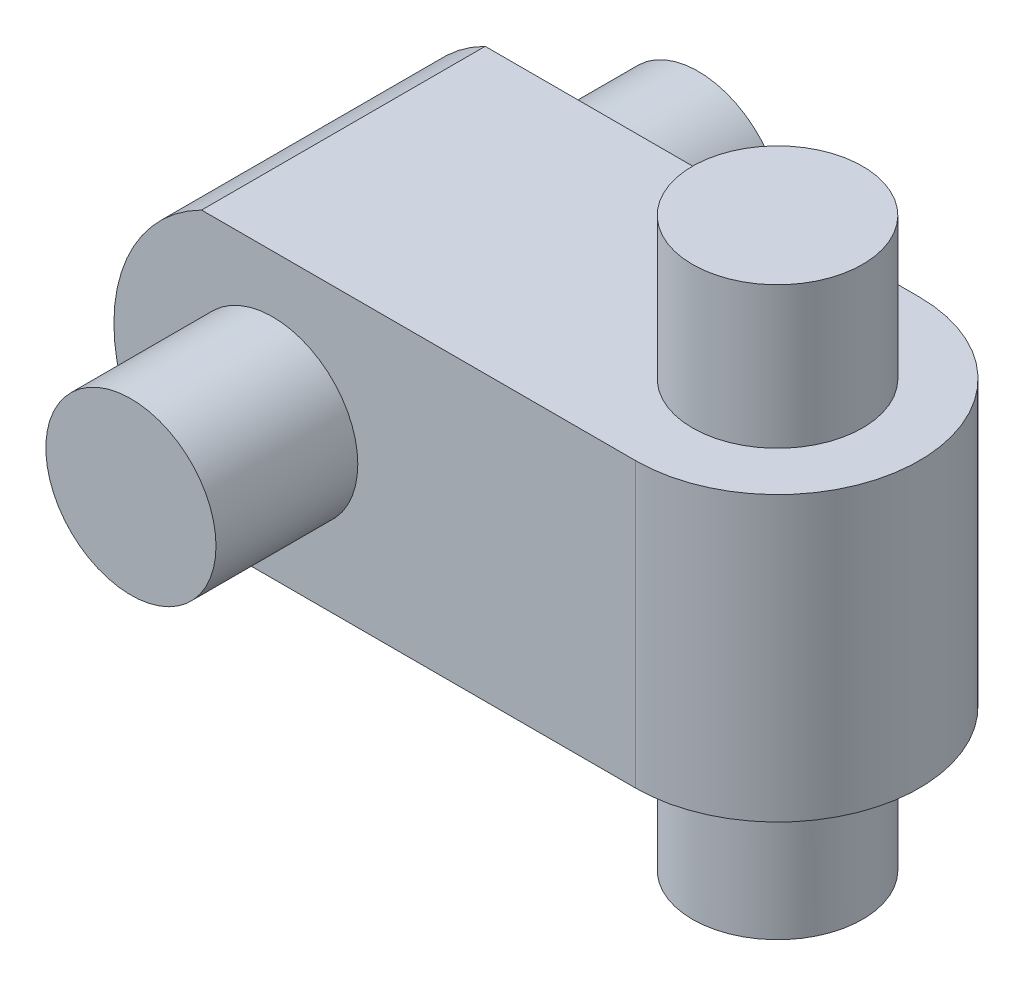
ISO-10303-21;
HEADER;
FILE_DESCRIPTION(('STEP AP214'),'2;1');
FILE_NAME('part.step','',(''),(''),'','','');
FILE_SCHEMA(('AUTOMOTIVE_DESIGN { 1 0 10303 214 1 1 1 1 }'));
ENDSEC;
DATA;
#1=APPLICATION_CONTEXT('core data for automotive mechanical design processes');
#2=APPLICATION_PROTOCOL_DEFINITION('international standard','automotive_design',2000,#1);
#3=PRODUCT_CONTEXT('',#1,'mechanical');
#4=PRODUCT('Part','Part','',(#3));
#5=PRODUCT_RELATED_PRODUCT_CATEGORY('part','',(#4));
#6=PRODUCT_DEFINITION_FORMATION('','',#4);
#7=PRODUCT_DEFINITION_CONTEXT('part definition',#1,'design');
#8=PRODUCT_DEFINITION('design','',#6,#7);
#9=PRODUCT_DEFINITION_SHAPE('','',#8);
#10=(LENGTH_UNIT() NAMED_UNIT(*) SI_UNIT(.MILLI.,.METRE.));
#11=(NAMED_UNIT(*) PLANE_ANGLE_UNIT() SI_UNIT($,.RADIAN.));
#12=(NAMED_UNIT(*) SI_UNIT($,.STERADIAN.) SOLID_ANGLE_UNIT());
#13=UNCERTAINTY_MEASURE_WITH_UNIT(LENGTH_MEASURE(1.E-05),#10,'distance_accuracy_value','');
#14=(GEOMETRIC_REPRESENTATION_CONTEXT(3) GLOBAL_UNCERTAINTY_ASSIGNED_CONTEXT((#13)) GLOBAL_UNIT_ASSIGNED_CONTEXT((#10,
#11,#12)) REPRESENTATION_CONTEXT('',''));
#15=CARTESIAN_POINT('',(0.,0.,0.));
#16=DIRECTION('',(0.,0.,1.));
#17=DIRECTION('',(1.,0.,0.));
#18=AXIS2_PLACEMENT_3D('',#15,#16,#17);
#19=CARTESIAN_POINT('',(-6.15277822894734,29.5086989575728,25.));
#20=DIRECTION('',(0.,0.,1.));
#21=DIRECTION('',(1.,0.,0.));
#22=AXIS2_PLACEMENT_3D('',#19,#20,#21);
#23=PLANE('',#22);
#24=CARTESIAN_POINT('',(-6.15277822894734,29.5086989575728,25.));
#25=DIRECTION('',(0.,0.,1.));
#26=DIRECTION('',(1.,0.,0.));
#27=AXIS2_PLACEMENT_3D('',#24,#25,#26);
#28=CIRCLE('',#27,7.5);
#29=CARTESIAN_POINT('',(1.34722177105266,29.5086989575728,25.));
#30=VERTEX_POINT('',#29);
#31=EDGE_CURVE('E180',#30,#30,#28,.F.);
#32=ORIENTED_EDGE('',*,*,#31,.T.);
#33=EDGE_LOOP('',(#32));
#34=FACE_BOUND('',#33,.T.);
#35=DIRECTION('',(-1.,0.,0.));
#36=VECTOR('',#35,1.);
#37=CARTESIAN_POINT('',(-6.15277822894734,17.0253656242395,25.));
#38=LINE('',#37,#36);
#39=CARTESIAN_POINT('',(25.8472217710527,17.0253656242395,25.));
#40=VERTEX_POINT('',#39);
#41=CARTESIAN_POINT('',(-12.4904740948665,17.0253656242395,25.));
#42=VERTEX_POINT('',#41);
#43=EDGE_CURVE('E66',#40,#42,#38,.T.);
#44=ORIENTED_EDGE('',*,*,#43,.F.);
#45=DIRECTION('',(0.,-1.,0.));
#46=VECTOR('',#45,1.);
#47=CARTESIAN_POINT('',(25.8472217710527,60.,25.));
#48=LINE('',#47,#46);
#49=CARTESIAN_POINT('',(25.8472217710527,42.0253656242395,25.));
#50=VERTEX_POINT('',#49);
#51=EDGE_CURVE('E110',#50,#40,#48,.T.);
#52=ORIENTED_EDGE('',*,*,#51,.F.);
#53=DIRECTION('',(-1.,0.,0.));
#54=VECTOR('',#53,1.);
#55=CARTESIAN_POINT('',(-6.15277822894734,42.0253656242395,25.));
#56=LINE('',#55,#54);
#57=CARTESIAN_POINT('',(-12.424385324067,42.0253656242395,25.));
#58=VERTEX_POINT('',#57);
#59=EDGE_CURVE('E106',#50,#58,#56,.T.);
#60=ORIENTED_EDGE('',*,*,#59,.T.);
#61=CARTESIAN_POINT('',(-6.15277822894734,29.5086989575728,25.));
#62=DIRECTION('',(0.,0.,1.));
#63=DIRECTION('',(1.,0.,0.));
#64=AXIS2_PLACEMENT_3D('',#61,#62,#63);
#65=CIRCLE('',#64,14.);
#66=EDGE_CURVE('E104',#58,#42,#65,.T.);
#67=ORIENTED_EDGE('',*,*,#66,.T.);
#68=EDGE_LOOP('',(#44,#52,#60,#67));
#69=FACE_BOUND('',#68,.T.);
#70=ADVANCED_FACE('F45',(#34,#69),#23,.T.);
#71=CARTESIAN_POINT('',(-6.15277822894734,29.5086989575728,0.));
#72=DIRECTION('',(0.,0.,1.));
#73=DIRECTION('',(1.,0.,0.));
#74=AXIS2_PLACEMENT_3D('',#71,#72,#73);
#75=PLANE('',#74);
#76=CARTESIAN_POINT('',(-6.15277822894734,29.5086989575728,0.));
#77=DIRECTION('',(0.,0.,1.));
#78=DIRECTION('',(1.,0.,0.));
#79=AXIS2_PLACEMENT_3D('',#76,#77,#78);
#80=CIRCLE('',#79,7.5);
#81=CARTESIAN_POINT('',(1.34722177105266,29.5086989575728,0.));
#82=VERTEX_POINT('',#81);
#83=EDGE_CURVE('E11',#82,#82,#80,.F.);
#84=ORIENTED_EDGE('',*,*,#83,.F.);
#85=EDGE_LOOP('',(#84));
#86=FACE_BOUND('',#85,.T.);
#87=DIRECTION('',(0.,-1.,0.));
#88=VECTOR('',#87,1.);
#89=CARTESIAN_POINT('',(25.8472217710527,60.,0.));
#90=LINE('',#89,#88);
#91=CARTESIAN_POINT('',(25.8472217710527,17.0253656242395,0.));
#92=VERTEX_POINT('',#91);
#93=CARTESIAN_POINT('',(25.8472217710527,42.0253656242395,0.));
#94=VERTEX_POINT('',#93);
#95=EDGE_CURVE('E114',#92,#94,#90,.F.);
#96=ORIENTED_EDGE('',*,*,#95,.F.);
#97=DIRECTION('',(1.,0.,0.));
#98=VECTOR('',#97,1.);
#99=CARTESIAN_POINT('',(0.,17.0253656242395,0.));
#100=LINE('',#99,#98);
#101=CARTESIAN_POINT('',(-12.4904740948665,17.0253656242395,0.));
#102=VERTEX_POINT('',#101);
#103=EDGE_CURVE('E61',#102,#92,#100,.T.);
#104=ORIENTED_EDGE('',*,*,#103,.F.);
#105=CARTESIAN_POINT('',(-6.15277822894734,29.5086989575728,0.));
#106=DIRECTION('',(0.,0.,1.));
#107=DIRECTION('',(1.,0.,0.));
#108=AXIS2_PLACEMENT_3D('',#105,#106,#107);
#109=CIRCLE('',#108,14.);
#110=CARTESIAN_POINT('',(-12.424385324067,42.0253656242395,0.));
#111=VERTEX_POINT('',#110);
#112=EDGE_CURVE('E102',#111,#102,#109,.T.);
#113=ORIENTED_EDGE('',*,*,#112,.F.);
#114=DIRECTION('',(1.,0.,0.));
#115=VECTOR('',#114,1.);
#116=CARTESIAN_POINT('',(0.,42.0253656242395,0.));
#117=LINE('',#116,#115);
#118=EDGE_CURVE('E85',#111,#94,#117,.T.);
#119=ORIENTED_EDGE('',*,*,#118,.T.);
#120=EDGE_LOOP('',(#96,#104,#113,#119));
#121=FACE_BOUND('',#120,.T.);
#122=ADVANCED_FACE('F108',(#86,#121),#75,.F.);
#123=CARTESIAN_POINT('',(-6.15277822894734,29.5086989575728,25.));
#124=DIRECTION('',(0.,0.,-1.));
#125=DIRECTION('',(-1.,0.,0.));
#126=AXIS2_PLACEMENT_3D('',#123,#124,#125);
#127=CYLINDRICAL_SURFACE('',#126,14.);
#128=ORIENTED_EDGE('',*,*,#112,.T.);
#129=DIRECTION('',(0.,0.,-1.));
#130=VECTOR('',#129,1.);
#131=CARTESIAN_POINT('',(-12.4904740948665,17.0253656242395,25.));
#132=LINE('',#131,#130);
#133=EDGE_CURVE('E117',#102,#42,#132,.F.);
#134=ORIENTED_EDGE('',*,*,#133,.T.);
#135=ORIENTED_EDGE('',*,*,#66,.F.);
#136=DIRECTION('',(0.,0.,-1.));
#137=VECTOR('',#136,1.);
#138=CARTESIAN_POINT('',(-12.424385324067,42.0253656242395,25.));
#139=LINE('',#138,#137);
#140=EDGE_CURVE('E89',#111,#58,#139,.F.);
#141=ORIENTED_EDGE('',*,*,#140,.F.);
#142=EDGE_LOOP('',(#128,#134,#135,#141));
#143=FACE_BOUND('',#142,.T.);
#144=ADVANCED_FACE('F47',(#143),#127,.T.);
#145=CARTESIAN_POINT('',(25.8472217710527,60.,12.5));
#146=DIRECTION('',(0.,-1.,0.));
#147=DIRECTION('',(0.,0.,-1.));
#148=AXIS2_PLACEMENT_3D('',#145,#146,#147);
#149=CYLINDRICAL_SURFACE('',#148,12.5);
#150=ORIENTED_EDGE('',*,*,#51,.T.);
#151=CARTESIAN_POINT('',(25.8472217710527,17.0253656242395,12.5));
#152=DIRECTION('',(0.,1.,0.));
#153=DIRECTION('',(-1.,0.,0.));
#154=AXIS2_PLACEMENT_3D('',#151,#152,#153);
#155=CIRCLE('',#154,12.5);
#156=EDGE_CURVE('E124',#40,#92,#155,.T.);
#157=ORIENTED_EDGE('',*,*,#156,.T.);
#158=ORIENTED_EDGE('',*,*,#95,.T.);
#159=CARTESIAN_POINT('',(25.8472217710527,42.0253656242395,12.5));
#160=DIRECTION('',(0.,1.,0.));
#161=DIRECTION('',(0.,0.,1.));
#162=AXIS2_PLACEMENT_3D('',#159,#160,#161);
#163=CIRCLE('',#162,12.5);
#164=EDGE_CURVE('E91',#50,#94,#163,.T.);
#165=ORIENTED_EDGE('',*,*,#164,.F.);
#166=EDGE_LOOP('',(#150,#157,#158,#165));
#167=FACE_BOUND('',#166,.T.);
#168=ADVANCED_FACE('F142',(#167),#149,.T.);
#169=CARTESIAN_POINT('',(0.,42.0253656242395,50.));
#170=DIRECTION('',(0.,1.,0.));
#171=DIRECTION('',(0.,0.,1.));
#172=AXIS2_PLACEMENT_3D('',#169,#170,#171);
#173=PLANE('',#172);
#174=CARTESIAN_POINT('',(25.8472217710527,42.0253656242395,12.5));
#175=DIRECTION('',(0.,1.,0.));
#176=DIRECTION('',(0.,0.,1.));
#177=AXIS2_PLACEMENT_3D('',#174,#175,#176);
#178=CIRCLE('',#177,7.5);
#179=CARTESIAN_POINT('',(25.8472217710527,42.0253656242395,20.));
#180=VERTEX_POINT('',#179);
#181=EDGE_CURVE('E97',#180,#180,#178,.F.);
#182=ORIENTED_EDGE('',*,*,#181,.T.);
#183=EDGE_LOOP('',(#182));
#184=FACE_BOUND('',#183,.T.);
#185=ORIENTED_EDGE('',*,*,#140,.T.);
#186=ORIENTED_EDGE('',*,*,#59,.F.);
#187=ORIENTED_EDGE('',*,*,#164,.T.);
#188=ORIENTED_EDGE('',*,*,#118,.F.);
#189=EDGE_LOOP('',(#185,#186,#187,#188));
#190=FACE_BOUND('',#189,.T.);
#191=ADVANCED_FACE('F87',(#184,#190),#173,.T.);
#192=CARTESIAN_POINT('',(0.,17.0253656242395,50.));
#193=DIRECTION('',(0.,1.,0.));
#194=DIRECTION('',(-1.,0.,0.));
#195=AXIS2_PLACEMENT_3D('',#192,#193,#194);
#196=PLANE('',#195);
#197=CARTESIAN_POINT('',(25.8472217710527,17.0253656242395,12.5));
#198=DIRECTION('',(0.,1.,0.));
#199=DIRECTION('',(-1.,0.,0.));
#200=AXIS2_PLACEMENT_3D('',#197,#198,#199);
#201=CIRCLE('',#200,7.5);
#202=CARTESIAN_POINT('',(18.3472217710527,17.0253656242395,12.5));
#203=VERTEX_POINT('',#202);
#204=EDGE_CURVE('E54',#203,#203,#201,.F.);
#205=ORIENTED_EDGE('',*,*,#204,.F.);
#206=EDGE_LOOP('',(#205));
#207=FACE_BOUND('',#206,.T.);
#208=ORIENTED_EDGE('',*,*,#103,.T.);
#209=ORIENTED_EDGE('',*,*,#156,.F.);
#210=ORIENTED_EDGE('',*,*,#43,.T.);
#211=ORIENTED_EDGE('',*,*,#133,.F.);
#212=EDGE_LOOP('',(#208,#209,#210,#211));
#213=FACE_BOUND('',#212,.T.);
#214=ADVANCED_FACE('F132',(#207,#213),#196,.F.);
#215=CARTESIAN_POINT('',(25.8472217710527,4.50869895757281,12.5));
#216=DIRECTION('',(0.,1.,0.));
#217=DIRECTION('',(0.,0.,1.));
#218=AXIS2_PLACEMENT_3D('',#215,#216,#217);
#219=PLANE('',#218);
#220=CARTESIAN_POINT('',(25.8472217710527,4.50869895757281,12.5));
#221=DIRECTION('',(0.,1.,0.));
#222=DIRECTION('',(0.,0.,1.));
#223=AXIS2_PLACEMENT_3D('',#220,#221,#222);
#224=CIRCLE('',#223,7.5);
#225=CARTESIAN_POINT('',(25.8472217710527,4.50869895757281,20.));
#226=VERTEX_POINT('',#225);
#227=EDGE_CURVE('E176',#226,#226,#224,.T.);
#228=ORIENTED_EDGE('',*,*,#227,.F.);
#229=EDGE_LOOP('',(#228));
#230=FACE_BOUND('',#229,.T.);
#231=ADVANCED_FACE('F134',(#230),#219,.F.);
#232=CARTESIAN_POINT('',(25.8472217710527,54.5086989575728,12.5));
#233=DIRECTION('',(0.,-1.,0.));
#234=DIRECTION('',(0.,0.,-1.));
#235=AXIS2_PLACEMENT_3D('',#232,#233,#234);
#236=CYLINDRICAL_SURFACE('',#235,7.5);
#237=ORIENTED_EDGE('',*,*,#227,.T.);
#238=EDGE_LOOP('',(#237));
#239=FACE_BOUND('',#238,.T.);
#240=ORIENTED_EDGE('',*,*,#204,.T.);
#241=EDGE_LOOP('',(#240));
#242=FACE_BOUND('',#241,.T.);
#243=ADVANCED_FACE('F130',(#239,#242),#236,.T.);
#244=ORIENTED_EDGE('',*,*,#181,.F.);
#245=EDGE_LOOP('',(#244));
#246=FACE_BOUND('',#245,.T.);
#247=CARTESIAN_POINT('',(25.8472217710527,54.5086989575728,12.5));
#248=DIRECTION('',(0.,1.,0.));
#249=DIRECTION('',(0.,0.,1.));
#250=AXIS2_PLACEMENT_3D('',#247,#248,#249);
#251=CIRCLE('',#250,7.5);
#252=CARTESIAN_POINT('',(25.8472217710527,54.5086989575728,20.));
#253=VERTEX_POINT('',#252);
#254=EDGE_CURVE('E175',#253,#253,#251,.T.);
#255=ORIENTED_EDGE('',*,*,#254,.F.);
#256=EDGE_LOOP('',(#255));
#257=FACE_BOUND('',#256,.T.);
#258=ADVANCED_FACE('F213',(#246,#257),#236,.T.);
#259=CARTESIAN_POINT('',(25.8472217710527,54.5086989575728,12.5));
#260=DIRECTION('',(0.,1.,0.));
#261=DIRECTION('',(0.,0.,1.));
#262=AXIS2_PLACEMENT_3D('',#259,#260,#261);
#263=PLANE('',#262);
#264=ORIENTED_EDGE('',*,*,#254,.T.);
#265=EDGE_LOOP('',(#264));
#266=FACE_BOUND('',#265,.T.);
#267=ADVANCED_FACE('F212',(#266),#263,.T.);
#268=CARTESIAN_POINT('',(-6.15277822894734,29.5086989575728,-12.5));
#269=DIRECTION('',(0.,0.,1.));
#270=DIRECTION('',(1.,0.,0.));
#271=AXIS2_PLACEMENT_3D('',#268,#269,#270);
#272=PLANE('',#271);
#273=CARTESIAN_POINT('',(-6.15277822894734,29.5086989575728,-12.5));
#274=DIRECTION('',(0.,0.,1.));
#275=DIRECTION('',(1.,0.,0.));
#276=AXIS2_PLACEMENT_3D('',#273,#274,#275);
#277=CIRCLE('',#276,7.5);
#278=CARTESIAN_POINT('',(1.34722177105266,29.5086989575728,-12.5));
#279=VERTEX_POINT('',#278);
#280=EDGE_CURVE('E187',#279,#279,#277,.T.);
#281=ORIENTED_EDGE('',*,*,#280,.F.);
#282=EDGE_LOOP('',(#281));
#283=FACE_BOUND('',#282,.T.);
#284=ADVANCED_FACE('F207',(#283),#272,.F.);
#285=CARTESIAN_POINT('',(-6.15277822894734,29.5086989575728,37.5));
#286=DIRECTION('',(0.,0.,-1.));
#287=DIRECTION('',(-1.,0.,0.));
#288=AXIS2_PLACEMENT_3D('',#285,#286,#287);
#289=CYLINDRICAL_SURFACE('',#288,7.5);
#290=ORIENTED_EDGE('',*,*,#280,.T.);
#291=EDGE_LOOP('',(#290));
#292=FACE_BOUND('',#291,.T.);
#293=ORIENTED_EDGE('',*,*,#83,.T.);
#294=EDGE_LOOP('',(#293));
#295=FACE_BOUND('',#294,.T.);
#296=ADVANCED_FACE('F199',(#292,#295),#289,.T.);
#297=ORIENTED_EDGE('',*,*,#31,.F.);
#298=EDGE_LOOP('',(#297));
#299=FACE_BOUND('',#298,.T.);
#300=CARTESIAN_POINT('',(-6.15277822894734,29.5086989575728,37.5));
#301=DIRECTION('',(0.,0.,1.));
#302=DIRECTION('',(1.,0.,0.));
#303=AXIS2_PLACEMENT_3D('',#300,#301,#302);
#304=CIRCLE('',#303,7.5);
#305=CARTESIAN_POINT('',(1.34722177105266,29.5086989575728,37.5));
#306=VERTEX_POINT('',#305);
#307=EDGE_CURVE('E186',#306,#306,#304,.T.);
#308=ORIENTED_EDGE('',*,*,#307,.F.);
#309=EDGE_LOOP('',(#308));
#310=FACE_BOUND('',#309,.T.);
#311=ADVANCED_FACE('F197',(#299,#310),#289,.T.);
#312=CARTESIAN_POINT('',(-6.15277822894734,29.5086989575728,37.5));
#313=DIRECTION('',(0.,0.,1.));
#314=DIRECTION('',(1.,0.,0.));
#315=AXIS2_PLACEMENT_3D('',#312,#313,#314);
#316=PLANE('',#315);
#317=ORIENTED_EDGE('',*,*,#307,.T.);
#318=EDGE_LOOP('',(#317));
#319=FACE_BOUND('',#318,.T.);
#320=ADVANCED_FACE('F195',(#319),#316,.T.);
#321=CLOSED_SHELL('',(#70,#122,#144,#168,#191,#214,#231,#243,#258,#267,#284,#296,#311,#320));
#322=MANIFOLD_SOLID_BREP('B2',#321);
#323=ADVANCED_BREP_SHAPE_REPRESENTATION('',(#18,#322),#14);
#324=SHAPE_DEFINITION_REPRESENTATION(#9,#323);
ENDSEC;
END-ISO-10303-21;
